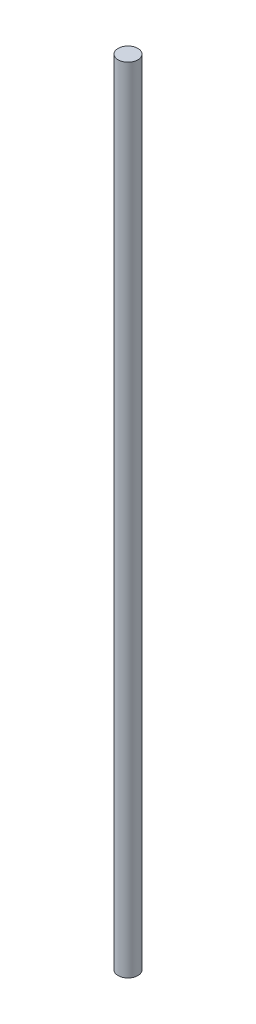
ISO-10303-21;
HEADER;
FILE_DESCRIPTION(('STEP AP214'),'2;1');
FILE_NAME('part.step','',(''),(''),'','','');
FILE_SCHEMA(('AUTOMOTIVE_DESIGN { 1 0 10303 214 1 1 1 1 }'));
ENDSEC;
DATA;
#1=APPLICATION_CONTEXT('core data for automotive mechanical design processes');
#2=APPLICATION_PROTOCOL_DEFINITION('international standard','automotive_design',2000,#1);
#3=PRODUCT_CONTEXT('',#1,'mechanical');
#4=PRODUCT('Part','Part','',(#3));
#5=PRODUCT_RELATED_PRODUCT_CATEGORY('part','',(#4));
#6=PRODUCT_DEFINITION_FORMATION('','',#4);
#7=PRODUCT_DEFINITION_CONTEXT('part definition',#1,'design');
#8=PRODUCT_DEFINITION('design','',#6,#7);
#9=PRODUCT_DEFINITION_SHAPE('','',#8);
#10=(LENGTH_UNIT() NAMED_UNIT(*) SI_UNIT(.MILLI.,.METRE.));
#11=(NAMED_UNIT(*) PLANE_ANGLE_UNIT() SI_UNIT($,.RADIAN.));
#12=(NAMED_UNIT(*) SI_UNIT($,.STERADIAN.) SOLID_ANGLE_UNIT());
#13=UNCERTAINTY_MEASURE_WITH_UNIT(LENGTH_MEASURE(1.E-05),#10,'distance_accuracy_value','');
#14=(GEOMETRIC_REPRESENTATION_CONTEXT(3) GLOBAL_UNCERTAINTY_ASSIGNED_CONTEXT((#13)) GLOBAL_UNIT_ASSIGNED_CONTEXT((#10,
#11,#12)) REPRESENTATION_CONTEXT('',''));
#15=CARTESIAN_POINT('',(0.,0.,0.));
#16=DIRECTION('',(0.,0.,1.));
#17=DIRECTION('',(1.,0.,0.));
#18=AXIS2_PLACEMENT_3D('',#15,#16,#17);
#19=CARTESIAN_POINT('',(0.,10.,0.));
#20=DIRECTION('',(0.,-1.,0.));
#21=DIRECTION('',(0.,0.,-1.));
#22=AXIS2_PLACEMENT_3D('',#19,#20,#21);
#23=CYLINDRICAL_SURFACE('',#22,0.25);
#24=CARTESIAN_POINT('',(0.,10.,0.));
#25=DIRECTION('',(0.,1.,0.));
#26=DIRECTION('',(0.,0.,1.));
#27=AXIS2_PLACEMENT_3D('',#24,#25,#26);
#28=CIRCLE('',#27,0.25);
#29=CARTESIAN_POINT('',(0.,10.,0.25));
#30=VERTEX_POINT('',#29);
#31=EDGE_CURVE('E10',#30,#30,#28,.T.);
#32=ORIENTED_EDGE('',*,*,#31,.F.);
#33=EDGE_LOOP('',(#32));
#34=FACE_BOUND('',#33,.T.);
#35=CARTESIAN_POINT('',(0.,-10.,0.));
#36=DIRECTION('',(0.,1.,0.));
#37=DIRECTION('',(0.,0.,1.));
#38=AXIS2_PLACEMENT_3D('',#35,#36,#37);
#39=CIRCLE('',#38,0.25);
#40=CARTESIAN_POINT('',(0.,-10.,0.25));
#41=VERTEX_POINT('',#40);
#42=EDGE_CURVE('E34',#41,#41,#39,.T.);
#43=ORIENTED_EDGE('',*,*,#42,.T.);
#44=EDGE_LOOP('',(#43));
#45=FACE_BOUND('',#44,.T.);
#46=ADVANCED_FACE('F31',(#34,#45),#23,.T.);
#47=CARTESIAN_POINT('',(0.,10.,0.));
#48=DIRECTION('',(0.,1.,0.));
#49=DIRECTION('',(0.,0.,1.));
#50=AXIS2_PLACEMENT_3D('',#47,#48,#49);
#51=PLANE('',#50);
#52=ORIENTED_EDGE('',*,*,#31,.T.);
#53=EDGE_LOOP('',(#52));
#54=FACE_BOUND('',#53,.T.);
#55=ADVANCED_FACE('F46',(#54),#51,.T.);
#56=CARTESIAN_POINT('',(0.,-10.,0.));
#57=DIRECTION('',(0.,1.,0.));
#58=DIRECTION('',(0.,0.,1.));
#59=AXIS2_PLACEMENT_3D('',#56,#57,#58);
#60=PLANE('',#59);
#61=ORIENTED_EDGE('',*,*,#42,.F.);
#62=EDGE_LOOP('',(#61));
#63=FACE_BOUND('',#62,.T.);
#64=ADVANCED_FACE('F44',(#63),#60,.F.);
#65=CLOSED_SHELL('',(#46,#55,#64));
#66=MANIFOLD_SOLID_BREP('B2',#65);
#67=ADVANCED_BREP_SHAPE_REPRESENTATION('',(#18,#66),#14);
#68=SHAPE_DEFINITION_REPRESENTATION(#9,#67);
ENDSEC;
END-ISO-10303-21;
